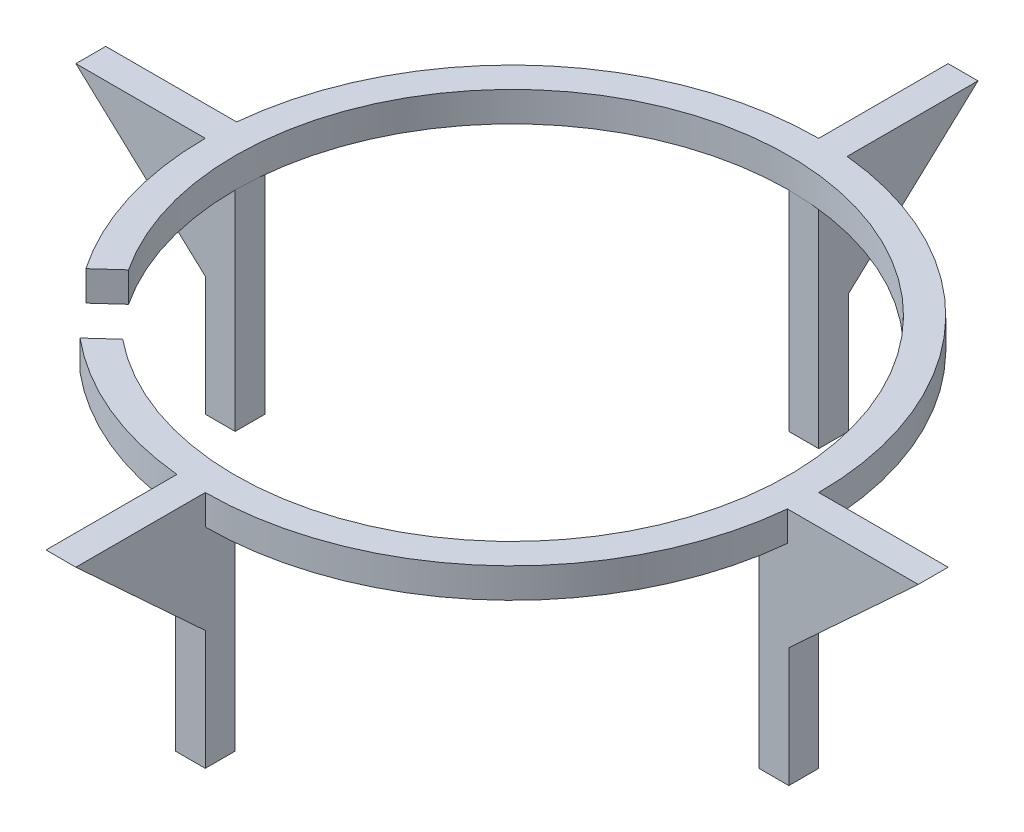
ISO-10303-21;
HEADER;
FILE_DESCRIPTION(('STEP AP214'),'2;1');
FILE_NAME('part.step','',(''),(''),'','','');
FILE_SCHEMA(('AUTOMOTIVE_DESIGN { 1 0 10303 214 1 1 1 1 }'));
ENDSEC;
DATA;
#1=APPLICATION_CONTEXT('core data for automotive mechanical design processes');
#2=APPLICATION_PROTOCOL_DEFINITION('international standard','automotive_design',2000,#1);
#3=PRODUCT_CONTEXT('',#1,'mechanical');
#4=PRODUCT('Part','Part','',(#3));
#5=PRODUCT_RELATED_PRODUCT_CATEGORY('part','',(#4));
#6=PRODUCT_DEFINITION_FORMATION('','',#4);
#7=PRODUCT_DEFINITION_CONTEXT('part definition',#1,'design');
#8=PRODUCT_DEFINITION('design','',#6,#7);
#9=PRODUCT_DEFINITION_SHAPE('','',#8);
#10=(LENGTH_UNIT() NAMED_UNIT(*) SI_UNIT(.MILLI.,.METRE.));
#11=(NAMED_UNIT(*) PLANE_ANGLE_UNIT() SI_UNIT($,.RADIAN.));
#12=(NAMED_UNIT(*) SI_UNIT($,.STERADIAN.) SOLID_ANGLE_UNIT());
#13=UNCERTAINTY_MEASURE_WITH_UNIT(LENGTH_MEASURE(1.E-05),#10,'distance_accuracy_value','');
#14=(GEOMETRIC_REPRESENTATION_CONTEXT(3) GLOBAL_UNCERTAINTY_ASSIGNED_CONTEXT((#13)) GLOBAL_UNIT_ASSIGNED_CONTEXT((#10,
#11,#12)) REPRESENTATION_CONTEXT('',''));
#15=CARTESIAN_POINT('',(0.,0.,0.));
#16=DIRECTION('',(0.,0.,1.));
#17=DIRECTION('',(1.,0.,0.));
#18=AXIS2_PLACEMENT_3D('',#15,#16,#17);
#19=CARTESIAN_POINT('',(-204.147335824536,-7.5,0.));
#20=DIRECTION('',(0.,1.,0.));
#21=DIRECTION('',(0.,0.,-1.));
#22=AXIS2_PLACEMENT_3D('',#19,#20,#21);
#23=PLANE('',#22);
#24=DIRECTION('',(-0.740730944108001,0.,0.671801807411136));
#25=VECTOR('',#24,1.);
#26=CARTESIAN_POINT('',(-163.898926075327,-7.5,44.3780326630348));
#27=LINE('',#26,#25);
#28=CARTESIAN_POINT('',(-174.583131741903,-7.5,54.0680135321355));
#29=VERTEX_POINT('',#28);
#30=CARTESIAN_POINT('',(-180.198752894633,-7.5,59.1610698843092));
#31=VERTEX_POINT('',#30);
#32=EDGE_CURVE('E38',#29,#31,#27,.T.);
#33=ORIENTED_EDGE('',*,*,#32,.F.);
#34=CARTESIAN_POINT('',(-130.867335824536,-7.5,0.));
#35=DIRECTION('',(0.,1.,0.));
#36=DIRECTION('',(0.,0.,-1.));
#37=AXIS2_PLACEMENT_3D('',#34,#35,#36);
#38=CIRCLE('',#37,69.53);
#39=CARTESIAN_POINT('',(-130.867335824536,-7.5,69.53));
#40=VERTEX_POINT('',#39);
#41=EDGE_CURVE('E250',#29,#40,#38,.T.);
#42=ORIENTED_EDGE('',*,*,#41,.T.);
#43=DIRECTION('',(1.,0.,0.));
#44=VECTOR('',#43,1.);
#45=CARTESIAN_POINT('',(-138.367335824536,-7.5,69.53));
#46=LINE('',#45,#44);
#47=CARTESIAN_POINT('',(-138.367335824536,-7.5,69.53));
#48=VERTEX_POINT('',#47);
#49=EDGE_CURVE('E259',#48,#40,#46,.T.);
#50=ORIENTED_EDGE('',*,*,#49,.F.);
#51=DIRECTION('',(0.,0.,-1.));
#52=VECTOR('',#51,1.);
#53=CARTESIAN_POINT('',(-138.367335824536,-7.5,89.53));
#54=LINE('',#53,#52);
#55=CARTESIAN_POINT('',(-138.367335824536,-7.5,76.6640130700187));
#56=VERTEX_POINT('',#55);
#57=EDGE_CURVE('E297',#56,#48,#54,.T.);
#58=ORIENTED_EDGE('',*,*,#57,.F.);
#59=CARTESIAN_POINT('',(-130.867335824536,-7.5,0.));
#60=DIRECTION('',(0.,1.,0.));
#61=DIRECTION('',(0.,0.,-1.));
#62=AXIS2_PLACEMENT_3D('',#59,#60,#61);
#63=CIRCLE('',#62,77.03);
#64=EDGE_CURVE('E252',#31,#56,#63,.T.);
#65=ORIENTED_EDGE('',*,*,#64,.F.);
#66=EDGE_LOOP('',(#33,#42,#50,#58,#65));
#67=FACE_BOUND('',#66,.T.);
#68=ADVANCED_FACE('F16',(#67),#23,.F.);
#69=CARTESIAN_POINT('',(-130.867335824536,-18.1504614045984,0.));
#70=DIRECTION('',(0.,1.,0.));
#71=DIRECTION('',(0.,0.,-1.));
#72=AXIS2_PLACEMENT_3D('',#69,#70,#71);
#73=CYLINDRICAL_SURFACE('',#72,77.03);
#74=CARTESIAN_POINT('',(-130.867335824536,0.,0.));
#75=DIRECTION('',(0.,1.,0.));
#76=DIRECTION('',(0.,0.,-1.));
#77=AXIS2_PLACEMENT_3D('',#74,#75,#76);
#78=CIRCLE('',#77,77.03);
#79=CARTESIAN_POINT('',(-180.198752894633,0.,59.1610698843092));
#80=VERTEX_POINT('',#79);
#81=CARTESIAN_POINT('',(-138.367335824536,0.,76.6640130700187));
#82=VERTEX_POINT('',#81);
#83=EDGE_CURVE('E236',#80,#82,#78,.T.);
#84=ORIENTED_EDGE('',*,*,#83,.F.);
#85=DIRECTION('',(0.,1.,0.));
#86=VECTOR('',#85,1.);
#87=CARTESIAN_POINT('',(-180.198752894633,-25.,59.1610698843092));
#88=LINE('',#87,#86);
#89=EDGE_CURVE('E221',#31,#80,#88,.T.);
#90=ORIENTED_EDGE('',*,*,#89,.F.);
#91=ORIENTED_EDGE('',*,*,#64,.T.);
#92=DIRECTION('',(0.,1.,0.));
#93=VECTOR('',#92,1.);
#94=CARTESIAN_POINT('',(-138.367335824536,-18.1504614045984,76.6640130700187));
#95=LINE('',#94,#93);
#96=EDGE_CURVE('E245',#56,#82,#95,.T.);
#97=ORIENTED_EDGE('',*,*,#96,.T.);
#98=EDGE_LOOP('',(#84,#90,#91,#97));
#99=FACE_BOUND('',#98,.T.);
#100=ADVANCED_FACE('F243',(#99),#73,.T.);
#101=CARTESIAN_POINT('',(-61.3373358245363,-30.,7.5));
#102=DIRECTION('',(-1.,0.,0.));
#103=DIRECTION('',(0.,-1.,0.));
#104=AXIS2_PLACEMENT_3D('',#101,#102,#103);
#105=PLANE('',#104);
#106=DIRECTION('',(0.,1.,0.));
#107=VECTOR('',#106,1.);
#108=CARTESIAN_POINT('',(-61.3373358245363,-30.,7.5));
#109=LINE('',#108,#107);
#110=CARTESIAN_POINT('',(-61.3373358245363,-60.,7.5));
#111=VERTEX_POINT('',#110);
#112=CARTESIAN_POINT('',(-61.3373358245363,-7.5,7.5));
#113=VERTEX_POINT('',#112);
#114=EDGE_CURVE('E317',#111,#113,#109,.T.);
#115=ORIENTED_EDGE('',*,*,#114,.T.);
#116=DIRECTION('',(0.,0.,-1.));
#117=VECTOR('',#116,1.);
#118=CARTESIAN_POINT('',(-61.3373358245363,-7.5,7.5));
#119=LINE('',#118,#117);
#120=CARTESIAN_POINT('',(-61.3373358245363,-7.5,0.));
#121=VERTEX_POINT('',#120);
#122=EDGE_CURVE('E314',#113,#121,#119,.T.);
#123=ORIENTED_EDGE('',*,*,#122,.T.);
#124=DIRECTION('',(0.,1.,0.));
#125=VECTOR('',#124,1.);
#126=CARTESIAN_POINT('',(-61.3373358245363,-30.,0.));
#127=LINE('',#126,#125);
#128=CARTESIAN_POINT('',(-61.3373358245363,-60.,0.));
#129=VERTEX_POINT('',#128);
#130=EDGE_CURVE('E316',#129,#121,#127,.T.);
#131=ORIENTED_EDGE('',*,*,#130,.F.);
#132=DIRECTION('',(0.,0.,-1.));
#133=VECTOR('',#132,1.);
#134=CARTESIAN_POINT('',(-61.3373358245363,-60.,7.5));
#135=LINE('',#134,#133);
#136=EDGE_CURVE('E348',#111,#129,#135,.T.);
#137=ORIENTED_EDGE('',*,*,#136,.F.);
#138=EDGE_LOOP('',(#115,#123,#131,#137));
#139=FACE_BOUND('',#138,.T.);
#140=ADVANCED_FACE('F18',(#139),#105,.T.);
#141=CARTESIAN_POINT('',(-41.3373358245362,-30.,7.5));
#142=DIRECTION('',(0.,0.,1.));
#143=DIRECTION('',(1.,0.,0.));
#144=AXIS2_PLACEMENT_3D('',#141,#142,#143);
#145=PLANE('',#144);
#146=DIRECTION('',(0.,1.,0.));
#147=VECTOR('',#146,1.);
#148=CARTESIAN_POINT('',(-54.2033227545176,-18.1504614045984,7.5));
#149=LINE('',#148,#147);
#150=CARTESIAN_POINT('',(-54.2033227545176,-7.5,7.5));
#151=VERTEX_POINT('',#150);
#152=CARTESIAN_POINT('',(-54.2033227545176,0.,7.5));
#153=VERTEX_POINT('',#152);
#154=EDGE_CURVE('E350',#151,#153,#149,.T.);
#155=ORIENTED_EDGE('',*,*,#154,.F.);
#156=DIRECTION('',(-1.,0.,0.));
#157=VECTOR('',#156,1.);
#158=CARTESIAN_POINT('',(-41.3373358245363,-7.5,7.5));
#159=LINE('',#158,#157);
#160=EDGE_CURVE('E24',#151,#113,#159,.T.);
#161=ORIENTED_EDGE('',*,*,#160,.T.);
#162=ORIENTED_EDGE('',*,*,#114,.F.);
#163=DIRECTION('',(1.,0.,0.));
#164=VECTOR('',#163,1.);
#165=CARTESIAN_POINT('',(-57.5873358245363,-60.,7.5));
#166=LINE('',#165,#164);
#167=CARTESIAN_POINT('',(-53.8373358245363,-60.,7.5));
#168=VERTEX_POINT('',#167);
#169=EDGE_CURVE('E320',#111,#168,#166,.T.);
#170=ORIENTED_EDGE('',*,*,#169,.T.);
#171=DIRECTION('',(0.,1.,0.));
#172=VECTOR('',#171,1.);
#173=CARTESIAN_POINT('',(-53.8373358245363,-45.,7.5));
#174=LINE('',#173,#172);
#175=CARTESIAN_POINT('',(-53.8373358245363,-30.,7.5));
#176=VERTEX_POINT('',#175);
#177=EDGE_CURVE('E323',#168,#176,#174,.T.);
#178=ORIENTED_EDGE('',*,*,#177,.T.);
#179=DIRECTION('',(0.734803444627488,0.678280102733066,0.));
#180=VECTOR('',#179,1.);
#181=CARTESIAN_POINT('',(-37.5873358245363,-15.,7.5));
#182=LINE('',#181,#180);
#183=CARTESIAN_POINT('',(-21.3373358245363,0.,7.5));
#184=VERTEX_POINT('',#183);
#185=EDGE_CURVE('E325',#176,#184,#182,.T.);
#186=ORIENTED_EDGE('',*,*,#185,.T.);
#187=DIRECTION('',(-1.,0.,0.));
#188=VECTOR('',#187,1.);
#189=CARTESIAN_POINT('',(-41.3373358245363,0.,7.5));
#190=LINE('',#189,#188);
#191=EDGE_CURVE('E327',#184,#153,#190,.T.);
#192=ORIENTED_EDGE('',*,*,#191,.T.);
#193=EDGE_LOOP('',(#155,#161,#162,#170,#178,#186,#192));
#194=FACE_BOUND('',#193,.T.);
#195=ADVANCED_FACE('F355',(#194),#145,.T.);
#196=CARTESIAN_POINT('',(-57.5873358245363,-60.,7.5));
#197=DIRECTION('',(0.,1.,0.));
#198=DIRECTION('',(0.,0.,1.));
#199=AXIS2_PLACEMENT_3D('',#196,#197,#198);
#200=PLANE('',#199);
#201=DIRECTION('',(1.,0.,0.));
#202=VECTOR('',#201,1.);
#203=CARTESIAN_POINT('',(-57.5873358245363,-60.,0.));
#204=LINE('',#203,#202);
#205=CARTESIAN_POINT('',(-53.8373358245363,-60.,0.));
#206=VERTEX_POINT('',#205);
#207=EDGE_CURVE('E332',#129,#206,#204,.T.);
#208=ORIENTED_EDGE('',*,*,#207,.T.);
#209=DIRECTION('',(0.,0.,-1.));
#210=VECTOR('',#209,1.);
#211=CARTESIAN_POINT('',(-53.8373358245363,-60.,7.5));
#212=LINE('',#211,#210);
#213=EDGE_CURVE('E345',#168,#206,#212,.T.);
#214=ORIENTED_EDGE('',*,*,#213,.F.);
#215=ORIENTED_EDGE('',*,*,#169,.F.);
#216=ORIENTED_EDGE('',*,*,#136,.T.);
#217=EDGE_LOOP('',(#208,#214,#215,#216));
#218=FACE_BOUND('',#217,.T.);
#219=ADVANCED_FACE('F652',(#218),#200,.F.);
#220=CARTESIAN_POINT('',(-53.8373358245363,-45.,7.5));
#221=DIRECTION('',(-1.,0.,0.));
#222=DIRECTION('',(0.,-1.,0.));
#223=AXIS2_PLACEMENT_3D('',#220,#221,#222);
#224=PLANE('',#223);
#225=DIRECTION('',(0.,1.,0.));
#226=VECTOR('',#225,1.);
#227=CARTESIAN_POINT('',(-53.8373358245363,-45.,0.));
#228=LINE('',#227,#226);
#229=CARTESIAN_POINT('',(-53.8373358245363,-30.,0.));
#230=VERTEX_POINT('',#229);
#231=EDGE_CURVE('E334',#206,#230,#228,.T.);
#232=ORIENTED_EDGE('',*,*,#231,.T.);
#233=DIRECTION('',(0.,0.,-1.));
#234=VECTOR('',#233,1.);
#235=CARTESIAN_POINT('',(-53.8373358245363,-30.,7.5));
#236=LINE('',#235,#234);
#237=EDGE_CURVE('E342',#176,#230,#236,.T.);
#238=ORIENTED_EDGE('',*,*,#237,.F.);
#239=ORIENTED_EDGE('',*,*,#177,.F.);
#240=ORIENTED_EDGE('',*,*,#213,.T.);
#241=EDGE_LOOP('',(#232,#238,#239,#240));
#242=FACE_BOUND('',#241,.T.);
#243=ADVANCED_FACE('F659',(#242),#224,.F.);
#244=CARTESIAN_POINT('',(-37.5873358245363,-15.,7.5));
#245=DIRECTION('',(-0.678280102733066,0.734803444627488,0.));
#246=DIRECTION('',(-0.734803444627488,-0.678280102733066,0.));
#247=AXIS2_PLACEMENT_3D('',#244,#245,#246);
#248=PLANE('',#247);
#249=DIRECTION('',(0.734803444627488,0.678280102733066,0.));
#250=VECTOR('',#249,1.);
#251=CARTESIAN_POINT('',(-37.5873358245363,-15.,0.));
#252=LINE('',#251,#250);
#253=CARTESIAN_POINT('',(-21.3373358245363,0.,0.));
#254=VERTEX_POINT('',#253);
#255=EDGE_CURVE('E336',#230,#254,#252,.T.);
#256=ORIENTED_EDGE('',*,*,#255,.T.);
#257=DIRECTION('',(0.,0.,-1.));
#258=VECTOR('',#257,1.);
#259=CARTESIAN_POINT('',(-21.3373358245363,0.,7.5));
#260=LINE('',#259,#258);
#261=EDGE_CURVE('E329',#184,#254,#260,.T.);
#262=ORIENTED_EDGE('',*,*,#261,.F.);
#263=ORIENTED_EDGE('',*,*,#185,.F.);
#264=ORIENTED_EDGE('',*,*,#237,.T.);
#265=EDGE_LOOP('',(#256,#262,#263,#264));
#266=FACE_BOUND('',#265,.T.);
#267=ADVANCED_FACE('F534',(#266),#248,.F.);
#268=CARTESIAN_POINT('',(-41.3373358245363,0.,7.5));
#269=DIRECTION('',(0.,-1.,0.));
#270=DIRECTION('',(0.,0.,-1.));
#271=AXIS2_PLACEMENT_3D('',#268,#269,#270);
#272=PLANE('',#271);
#273=CARTESIAN_POINT('',(-130.867335824536,0.,0.));
#274=DIRECTION('',(0.,1.,0.));
#275=DIRECTION('',(-1.,0.,0.));
#276=AXIS2_PLACEMENT_3D('',#273,#274,#275);
#277=CIRCLE('',#276,69.53);
#278=CARTESIAN_POINT('',(-174.583131741903,0.,54.0680135321355));
#279=VERTEX_POINT('',#278);
#280=CARTESIAN_POINT('',(-188.934833753626,0.,38.2437783731562));
#281=VERTEX_POINT('',#280);
#282=EDGE_CURVE('E239',#279,#281,#277,.T.);
#283=ORIENTED_EDGE('',*,*,#282,.F.);
#284=DIRECTION('',(-0.740730944108001,0.,0.671801807411136));
#285=VECTOR('',#284,1.);
#286=CARTESIAN_POINT('',(-177.390942318268,0.,56.6145417082223));
#287=LINE('',#286,#285);
#288=EDGE_CURVE('E224',#279,#80,#287,.T.);
#289=ORIENTED_EDGE('',*,*,#288,.T.);
#290=ORIENTED_EDGE('',*,*,#83,.T.);
#291=DIRECTION('',(0.,0.,-1.));
#292=VECTOR('',#291,1.);
#293=CARTESIAN_POINT('',(-138.367335824536,0.,89.53));
#294=LINE('',#293,#292);
#295=CARTESIAN_POINT('',(-138.367335824536,0.,109.53));
#296=VERTEX_POINT('',#295);
#297=EDGE_CURVE('E273',#296,#82,#294,.T.);
#298=ORIENTED_EDGE('',*,*,#297,.F.);
#299=DIRECTION('',(1.,0.,0.));
#300=VECTOR('',#299,1.);
#301=CARTESIAN_POINT('',(-138.367335824536,0.,109.53));
#302=LINE('',#301,#300);
#303=CARTESIAN_POINT('',(-130.867335824536,0.,109.53));
#304=VERTEX_POINT('',#303);
#305=EDGE_CURVE('E275',#296,#304,#302,.T.);
#306=ORIENTED_EDGE('',*,*,#305,.T.);
#307=DIRECTION('',(0.,0.,-1.));
#308=VECTOR('',#307,1.);
#309=CARTESIAN_POINT('',(-130.867335824536,0.,89.53));
#310=LINE('',#309,#308);
#311=CARTESIAN_POINT('',(-130.867335824536,0.,77.03));
#312=VERTEX_POINT('',#311);
#313=EDGE_CURVE('E267',#304,#312,#310,.T.);
#314=ORIENTED_EDGE('',*,*,#313,.T.);
#315=CARTESIAN_POINT('',(-130.867335824536,0.,0.));
#316=DIRECTION('',(0.,1.,0.));
#317=DIRECTION('',(-1.,0.,0.));
#318=AXIS2_PLACEMENT_3D('',#315,#316,#317);
#319=CIRCLE('',#318,77.03);
#320=EDGE_CURVE('E307',#312,#153,#319,.T.);
#321=ORIENTED_EDGE('',*,*,#320,.T.);
#322=ORIENTED_EDGE('',*,*,#191,.F.);
#323=ORIENTED_EDGE('',*,*,#261,.T.);
#324=DIRECTION('',(-1.,0.,0.));
#325=VECTOR('',#324,1.);
#326=CARTESIAN_POINT('',(-41.3373358245363,0.,0.));
#327=LINE('',#326,#325);
#328=CARTESIAN_POINT('',(-53.8373358245363,0.,0.));
#329=VERTEX_POINT('',#328);
#330=EDGE_CURVE('E321',#254,#329,#327,.T.);
#331=ORIENTED_EDGE('',*,*,#330,.T.);
#332=CARTESIAN_POINT('',(-130.867335824536,0.,0.));
#333=DIRECTION('',(0.,1.,0.));
#334=DIRECTION('',(0.,0.,1.));
#335=AXIS2_PLACEMENT_3D('',#332,#333,#334);
#336=CIRCLE('',#335,77.03);
#337=CARTESIAN_POINT('',(-123.367335824536,0.,-76.6640130700187));
#338=VERTEX_POINT('',#337);
#339=EDGE_CURVE('E380',#329,#338,#336,.T.);
#340=ORIENTED_EDGE('',*,*,#339,.T.);
#341=DIRECTION('',(0.,0.,1.));
#342=VECTOR('',#341,1.);
#343=CARTESIAN_POINT('',(-123.367335824536,0.,-89.53));
#344=LINE('',#343,#342);
#345=CARTESIAN_POINT('',(-123.367335824536,0.,-109.53));
#346=VERTEX_POINT('',#345);
#347=EDGE_CURVE('E411',#346,#338,#344,.T.);
#348=ORIENTED_EDGE('',*,*,#347,.F.);
#349=DIRECTION('',(-1.,0.,0.));
#350=VECTOR('',#349,1.);
#351=CARTESIAN_POINT('',(-123.367335824536,0.,-109.53));
#352=LINE('',#351,#350);
#353=CARTESIAN_POINT('',(-130.867335824536,0.,-109.53));
#354=VERTEX_POINT('',#353);
#355=EDGE_CURVE('E413',#346,#354,#352,.T.);
#356=ORIENTED_EDGE('',*,*,#355,.T.);
#357=DIRECTION('',(0.,0.,1.));
#358=VECTOR('',#357,1.);
#359=CARTESIAN_POINT('',(-130.867335824536,0.,-89.53));
#360=LINE('',#359,#358);
#361=CARTESIAN_POINT('',(-130.867335824536,0.,-77.03));
#362=VERTEX_POINT('',#361);
#363=EDGE_CURVE('E405',#354,#362,#360,.T.);
#364=ORIENTED_EDGE('',*,*,#363,.T.);
#365=CARTESIAN_POINT('',(-130.867335824536,0.,0.));
#366=DIRECTION('',(0.,1.,0.));
#367=DIRECTION('',(1.,0.,0.));
#368=AXIS2_PLACEMENT_3D('',#365,#366,#367);
#369=CIRCLE('',#368,77.03);
#370=CARTESIAN_POINT('',(-207.531348894555,0.,-7.5));
#371=VERTEX_POINT('',#370);
#372=EDGE_CURVE('E447',#362,#371,#369,.T.);
#373=ORIENTED_EDGE('',*,*,#372,.T.);
#374=DIRECTION('',(1.,0.,0.));
#375=VECTOR('',#374,1.);
#376=CARTESIAN_POINT('',(-220.397335824536,0.,-7.5));
#377=LINE('',#376,#375);
#378=CARTESIAN_POINT('',(-240.397335824536,0.,-7.5));
#379=VERTEX_POINT('',#378);
#380=EDGE_CURVE('E464',#379,#371,#377,.T.);
#381=ORIENTED_EDGE('',*,*,#380,.F.);
#382=DIRECTION('',(0.,0.,1.));
#383=VECTOR('',#382,1.);
#384=CARTESIAN_POINT('',(-240.397335824536,0.,-7.5));
#385=LINE('',#384,#383);
#386=CARTESIAN_POINT('',(-240.397335824536,0.,0.));
#387=VERTEX_POINT('',#386);
#388=EDGE_CURVE('E466',#379,#387,#385,.T.);
#389=ORIENTED_EDGE('',*,*,#388,.T.);
#390=DIRECTION('',(1.,0.,0.));
#391=VECTOR('',#390,1.);
#392=CARTESIAN_POINT('',(-220.397335824536,0.,0.));
#393=LINE('',#392,#391);
#394=CARTESIAN_POINT('',(-207.897335824536,0.,0.));
#395=VERTEX_POINT('',#394);
#396=EDGE_CURVE('E458',#387,#395,#393,.T.);
#397=ORIENTED_EDGE('',*,*,#396,.T.);
#398=CARTESIAN_POINT('',(-194.550454906357,0.,43.3368347253299));
#399=VERTEX_POINT('',#398);
#400=EDGE_CURVE('E246',#395,#399,#78,.T.);
#401=ORIENTED_EDGE('',*,*,#400,.T.);
#402=DIRECTION('',(-0.740730944108003,0.,0.671801807411134));
#403=VECTOR('',#402,1.);
#404=CARTESIAN_POINT('',(-192.59506106161,0.,41.5634011600781));
#405=LINE('',#404,#403);
#406=EDGE_CURVE('E30',#281,#399,#405,.T.);
#407=ORIENTED_EDGE('',*,*,#406,.F.);
#408=EDGE_LOOP('',(#283,#289,#290,#298,#306,#314,#321,#322,#323,#331,#340,#348,#356,#364,#373,
#381,#389,#397,#401,#407));
#409=FACE_BOUND('',#408,.T.);
#410=ADVANCED_FACE('F234',(#409),#272,.F.);
#411=CARTESIAN_POINT('',(-41.3373358245362,-30.,0.));
#412=DIRECTION('',(0.,0.,1.));
#413=DIRECTION('',(1.,0.,0.));
#414=AXIS2_PLACEMENT_3D('',#411,#412,#413);
#415=PLANE('',#414);
#416=ORIENTED_EDGE('',*,*,#130,.T.);
#417=DIRECTION('',(1.,0.,0.));
#418=VECTOR('',#417,1.);
#419=CARTESIAN_POINT('',(-57.5873358245363,-7.5,0.));
#420=LINE('',#419,#418);
#421=CARTESIAN_POINT('',(-53.8373358245363,-7.5,0.));
#422=VERTEX_POINT('',#421);
#423=EDGE_CURVE('E383',#121,#422,#420,.T.);
#424=ORIENTED_EDGE('',*,*,#423,.T.);
#425=DIRECTION('',(0.,-1.,0.));
#426=VECTOR('',#425,1.);
#427=CARTESIAN_POINT('',(-53.8373358245363,-3.75,0.));
#428=LINE('',#427,#426);
#429=EDGE_CURVE('E390',#329,#422,#428,.T.);
#430=ORIENTED_EDGE('',*,*,#429,.F.);
#431=ORIENTED_EDGE('',*,*,#330,.F.);
#432=ORIENTED_EDGE('',*,*,#255,.F.);
#433=ORIENTED_EDGE('',*,*,#231,.F.);
#434=ORIENTED_EDGE('',*,*,#207,.F.);
#435=EDGE_LOOP('',(#416,#424,#430,#431,#432,#433,#434));
#436=FACE_BOUND('',#435,.T.);
#437=ADVANCED_FACE('F537',(#436),#415,.F.);
#438=CARTESIAN_POINT('',(-130.867335824536,-7.5,73.28));
#439=DIRECTION('',(0.,1.,0.));
#440=DIRECTION('',(-1.,0.,0.));
#441=AXIS2_PLACEMENT_3D('',#438,#439,#440);
#442=PLANE('',#441);
#443=ORIENTED_EDGE('',*,*,#122,.F.);
#444=ORIENTED_EDGE('',*,*,#160,.F.);
#445=CARTESIAN_POINT('',(-130.867335824536,-7.5,0.));
#446=DIRECTION('',(0.,1.,0.));
#447=DIRECTION('',(-1.,0.,0.));
#448=AXIS2_PLACEMENT_3D('',#445,#446,#447);
#449=CIRCLE('',#448,77.03);
#450=CARTESIAN_POINT('',(-130.867335824536,-7.5,77.03));
#451=VERTEX_POINT('',#450);
#452=EDGE_CURVE('E304',#451,#151,#449,.T.);
#453=ORIENTED_EDGE('',*,*,#452,.F.);
#454=DIRECTION('',(0.,0.,1.));
#455=VECTOR('',#454,1.);
#456=CARTESIAN_POINT('',(-130.867335824536,-7.5,73.28));
#457=LINE('',#456,#455);
#458=EDGE_CURVE('E299',#40,#451,#457,.T.);
#459=ORIENTED_EDGE('',*,*,#458,.F.);
#460=CARTESIAN_POINT('',(-130.867335824536,-7.5,0.));
#461=DIRECTION('',(0.,1.,0.));
#462=DIRECTION('',(-1.,0.,0.));
#463=AXIS2_PLACEMENT_3D('',#460,#461,#462);
#464=CIRCLE('',#463,69.53);
#465=EDGE_CURVE('E311',#40,#121,#464,.T.);
#466=ORIENTED_EDGE('',*,*,#465,.T.);
#467=EDGE_LOOP('',(#443,#444,#453,#459,#466));
#468=FACE_BOUND('',#467,.T.);
#469=ADVANCED_FACE('F362',(#468),#442,.F.);
#470=CARTESIAN_POINT('',(-130.867335824536,-18.1504614045984,0.));
#471=DIRECTION('',(0.,1.,0.));
#472=DIRECTION('',(-1.,0.,0.));
#473=AXIS2_PLACEMENT_3D('',#470,#471,#472);
#474=CYLINDRICAL_SURFACE('',#473,69.53);
#475=DIRECTION('',(0.,1.,0.));
#476=VECTOR('',#475,1.);
#477=CARTESIAN_POINT('',(-174.583131741903,-25.,54.0680135321355));
#478=LINE('',#477,#476);
#479=EDGE_CURVE('E230',#29,#279,#478,.T.);
#480=ORIENTED_EDGE('',*,*,#479,.T.);
#481=ORIENTED_EDGE('',*,*,#282,.T.);
#482=DIRECTION('',(0.,1.,0.));
#483=VECTOR('',#482,1.);
#484=CARTESIAN_POINT('',(-188.934833753626,-25.,38.2437783731562));
#485=LINE('',#484,#483);
#486=CARTESIAN_POINT('',(-188.934833753626,-7.5,38.2437783731562));
#487=VERTEX_POINT('',#486);
#488=EDGE_CURVE('E240',#487,#281,#485,.T.);
#489=ORIENTED_EDGE('',*,*,#488,.F.);
#490=CARTESIAN_POINT('',(-200.397335824536,-7.5,0.));
#491=VERTEX_POINT('',#490);
#492=EDGE_CURVE('E256',#491,#487,#38,.T.);
#493=ORIENTED_EDGE('',*,*,#492,.F.);
#494=CARTESIAN_POINT('',(-130.867335824536,-7.5,0.));
#495=DIRECTION('',(0.,1.,0.));
#496=DIRECTION('',(1.,0.,0.));
#497=AXIS2_PLACEMENT_3D('',#494,#495,#496);
#498=CIRCLE('',#497,69.53);
#499=CARTESIAN_POINT('',(-130.867335824536,-7.5,-69.53));
#500=VERTEX_POINT('',#499);
#501=EDGE_CURVE('E375',#500,#491,#498,.T.);
#502=ORIENTED_EDGE('',*,*,#501,.F.);
#503=CARTESIAN_POINT('',(-130.867335824536,-7.5,0.));
#504=DIRECTION('',(0.,1.,0.));
#505=DIRECTION('',(0.,0.,1.));
#506=AXIS2_PLACEMENT_3D('',#503,#504,#505);
#507=CIRCLE('',#506,69.53);
#508=EDGE_CURVE('E370',#121,#500,#507,.T.);
#509=ORIENTED_EDGE('',*,*,#508,.F.);
#510=ORIENTED_EDGE('',*,*,#465,.F.);
#511=ORIENTED_EDGE('',*,*,#41,.F.);
#512=EDGE_LOOP('',(#480,#481,#489,#493,#502,#509,#510,#511));
#513=FACE_BOUND('',#512,.T.);
#514=ADVANCED_FACE('F372',(#513),#474,.F.);
#515=CARTESIAN_POINT('',(-130.867335824536,-18.1504614045984,0.));
#516=DIRECTION('',(0.,1.,0.));
#517=DIRECTION('',(-1.,0.,0.));
#518=AXIS2_PLACEMENT_3D('',#515,#516,#517);
#519=CYLINDRICAL_SURFACE('',#518,77.03);
#520=ORIENTED_EDGE('',*,*,#452,.T.);
#521=ORIENTED_EDGE('',*,*,#154,.T.);
#522=ORIENTED_EDGE('',*,*,#320,.F.);
#523=DIRECTION('',(0.,-1.,0.));
#524=VECTOR('',#523,1.);
#525=CARTESIAN_POINT('',(-130.867335824536,-3.75,77.03));
#526=LINE('',#525,#524);
#527=EDGE_CURVE('E301',#312,#451,#526,.T.);
#528=ORIENTED_EDGE('',*,*,#527,.T.);
#529=EDGE_LOOP('',(#520,#521,#522,#528));
#530=FACE_BOUND('',#529,.T.);
#531=ADVANCED_FACE('F526',(#530),#519,.T.);
#532=CARTESIAN_POINT('',(-130.867335824536,-30.,89.53));
#533=DIRECTION('',(-1.,0.,0.));
#534=DIRECTION('',(0.,0.,1.));
#535=AXIS2_PLACEMENT_3D('',#532,#533,#534);
#536=PLANE('',#535);
#537=DIRECTION('',(0.,1.,0.));
#538=VECTOR('',#537,1.);
#539=CARTESIAN_POINT('',(-130.867335824536,-30.,69.53));
#540=LINE('',#539,#538);
#541=CARTESIAN_POINT('',(-130.867335824536,-60.,69.53));
#542=VERTEX_POINT('',#541);
#543=EDGE_CURVE('E262',#542,#40,#540,.T.);
#544=ORIENTED_EDGE('',*,*,#543,.T.);
#545=ORIENTED_EDGE('',*,*,#458,.T.);
#546=ORIENTED_EDGE('',*,*,#527,.F.);
#547=ORIENTED_EDGE('',*,*,#313,.F.);
#548=DIRECTION('',(0.,0.678280102733066,0.734803444627488));
#549=VECTOR('',#548,1.);
#550=CARTESIAN_POINT('',(-130.867335824536,-15.,93.28));
#551=LINE('',#550,#549);
#552=CARTESIAN_POINT('',(-130.867335824536,-30.,77.03));
#553=VERTEX_POINT('',#552);
#554=EDGE_CURVE('E282',#553,#304,#551,.T.);
#555=ORIENTED_EDGE('',*,*,#554,.F.);
#556=DIRECTION('',(0.,1.,0.));
#557=VECTOR('',#556,1.);
#558=CARTESIAN_POINT('',(-130.867335824536,-45.,77.03));
#559=LINE('',#558,#557);
#560=CARTESIAN_POINT('',(-130.867335824536,-60.,77.03));
#561=VERTEX_POINT('',#560);
#562=EDGE_CURVE('E280',#561,#553,#559,.T.);
#563=ORIENTED_EDGE('',*,*,#562,.F.);
#564=DIRECTION('',(0.,0.,1.));
#565=VECTOR('',#564,1.);
#566=CARTESIAN_POINT('',(-130.867335824536,-60.,73.28));
#567=LINE('',#566,#565);
#568=EDGE_CURVE('E278',#542,#561,#567,.T.);
#569=ORIENTED_EDGE('',*,*,#568,.F.);
#570=EDGE_LOOP('',(#544,#545,#546,#547,#555,#563,#569));
#571=FACE_BOUND('',#570,.T.);
#572=ADVANCED_FACE('F508',(#571),#536,.F.);
#573=CARTESIAN_POINT('',(-138.367335824536,-30.,69.53));
#574=DIRECTION('',(0.,0.,-1.));
#575=DIRECTION('',(0.,-1.,0.));
#576=AXIS2_PLACEMENT_3D('',#573,#574,#575);
#577=PLANE('',#576);
#578=DIRECTION('',(0.,1.,0.));
#579=VECTOR('',#578,1.);
#580=CARTESIAN_POINT('',(-138.367335824536,-30.,69.53));
#581=LINE('',#580,#579);
#582=CARTESIAN_POINT('',(-138.367335824536,-60.,69.53));
#583=VERTEX_POINT('',#582);
#584=EDGE_CURVE('E263',#583,#48,#581,.T.);
#585=ORIENTED_EDGE('',*,*,#584,.T.);
#586=ORIENTED_EDGE('',*,*,#49,.T.);
#587=ORIENTED_EDGE('',*,*,#543,.F.);
#588=DIRECTION('',(1.,0.,0.));
#589=VECTOR('',#588,1.);
#590=CARTESIAN_POINT('',(-138.367335824536,-60.,69.53));
#591=LINE('',#590,#589);
#592=EDGE_CURVE('E294',#583,#542,#591,.T.);
#593=ORIENTED_EDGE('',*,*,#592,.F.);
#594=EDGE_LOOP('',(#585,#586,#587,#593));
#595=FACE_BOUND('',#594,.T.);
#596=ADVANCED_FACE('F505',(#595),#577,.T.);
#597=CARTESIAN_POINT('',(-138.367335824536,-30.,89.53));
#598=DIRECTION('',(-1.,0.,0.));
#599=DIRECTION('',(0.,0.,1.));
#600=AXIS2_PLACEMENT_3D('',#597,#598,#599);
#601=PLANE('',#600);
#602=ORIENTED_EDGE('',*,*,#96,.F.);
#603=ORIENTED_EDGE('',*,*,#57,.T.);
#604=ORIENTED_EDGE('',*,*,#584,.F.);
#605=DIRECTION('',(0.,0.,1.));
#606=VECTOR('',#605,1.);
#607=CARTESIAN_POINT('',(-138.367335824536,-60.,73.28));
#608=LINE('',#607,#606);
#609=CARTESIAN_POINT('',(-138.367335824536,-60.,77.03));
#610=VERTEX_POINT('',#609);
#611=EDGE_CURVE('E266',#583,#610,#608,.T.);
#612=ORIENTED_EDGE('',*,*,#611,.T.);
#613=DIRECTION('',(0.,1.,0.));
#614=VECTOR('',#613,1.);
#615=CARTESIAN_POINT('',(-138.367335824536,-45.,77.03));
#616=LINE('',#615,#614);
#617=CARTESIAN_POINT('',(-138.367335824536,-30.,77.03));
#618=VERTEX_POINT('',#617);
#619=EDGE_CURVE('E269',#610,#618,#616,.T.);
#620=ORIENTED_EDGE('',*,*,#619,.T.);
#621=DIRECTION('',(0.,0.678280102733066,0.734803444627488));
#622=VECTOR('',#621,1.);
#623=CARTESIAN_POINT('',(-138.367335824536,-15.,93.28));
#624=LINE('',#623,#622);
#625=EDGE_CURVE('E271',#618,#296,#624,.T.);
#626=ORIENTED_EDGE('',*,*,#625,.T.);
#627=ORIENTED_EDGE('',*,*,#297,.T.);
#628=EDGE_LOOP('',(#602,#603,#604,#612,#620,#626,#627));
#629=FACE_BOUND('',#628,.T.);
#630=ADVANCED_FACE('F500',(#629),#601,.T.);
#631=CARTESIAN_POINT('',(-138.367335824536,-60.,73.28));
#632=DIRECTION('',(0.,1.,0.));
#633=DIRECTION('',(-1.,0.,0.));
#634=AXIS2_PLACEMENT_3D('',#631,#632,#633);
#635=PLANE('',#634);
#636=ORIENTED_EDGE('',*,*,#568,.T.);
#637=DIRECTION('',(1.,0.,0.));
#638=VECTOR('',#637,1.);
#639=CARTESIAN_POINT('',(-138.367335824536,-60.,77.03));
#640=LINE('',#639,#638);
#641=EDGE_CURVE('E291',#610,#561,#640,.T.);
#642=ORIENTED_EDGE('',*,*,#641,.F.);
#643=ORIENTED_EDGE('',*,*,#611,.F.);
#644=ORIENTED_EDGE('',*,*,#592,.T.);
#645=EDGE_LOOP('',(#636,#642,#643,#644));
#646=FACE_BOUND('',#645,.T.);
#647=ADVANCED_FACE('F513',(#646),#635,.F.);
#648=CARTESIAN_POINT('',(-138.367335824536,-45.,77.03));
#649=DIRECTION('',(0.,0.,-1.));
#650=DIRECTION('',(0.,-1.,0.));
#651=AXIS2_PLACEMENT_3D('',#648,#649,#650);
#652=PLANE('',#651);
#653=ORIENTED_EDGE('',*,*,#562,.T.);
#654=DIRECTION('',(1.,0.,0.));
#655=VECTOR('',#654,1.);
#656=CARTESIAN_POINT('',(-138.367335824536,-30.,77.03));
#657=LINE('',#656,#655);
#658=EDGE_CURVE('E288',#618,#553,#657,.T.);
#659=ORIENTED_EDGE('',*,*,#658,.F.);
#660=ORIENTED_EDGE('',*,*,#619,.F.);
#661=ORIENTED_EDGE('',*,*,#641,.T.);
#662=EDGE_LOOP('',(#653,#659,#660,#661));
#663=FACE_BOUND('',#662,.T.);
#664=ADVANCED_FACE('F517',(#663),#652,.F.);
#665=CARTESIAN_POINT('',(-138.367335824536,-15.,93.28));
#666=DIRECTION('',(0.,0.734803444627488,-0.678280102733066));
#667=DIRECTION('',(0.,-0.678280102733066,-0.734803444627488));
#668=AXIS2_PLACEMENT_3D('',#665,#666,#667);
#669=PLANE('',#668);
#670=ORIENTED_EDGE('',*,*,#554,.T.);
#671=ORIENTED_EDGE('',*,*,#305,.F.);
#672=ORIENTED_EDGE('',*,*,#625,.F.);
#673=ORIENTED_EDGE('',*,*,#658,.T.);
#674=EDGE_LOOP('',(#670,#671,#672,#673));
#675=FACE_BOUND('',#674,.T.);
#676=ADVANCED_FACE('F522',(#675),#669,.F.);
#677=ORIENTED_EDGE('',*,*,#492,.T.);
#678=DIRECTION('',(-0.740730944108003,0.,0.671801807411134));
#679=VECTOR('',#678,1.);
#680=CARTESIAN_POINT('',(-178.250628087051,-7.5,28.5537975040555));
#681=LINE('',#680,#679);
#682=CARTESIAN_POINT('',(-194.550454906357,-7.5,43.3368347253299));
#683=VERTEX_POINT('',#682);
#684=EDGE_CURVE('E229',#487,#683,#681,.T.);
#685=ORIENTED_EDGE('',*,*,#684,.T.);
#686=CARTESIAN_POINT('',(-207.897335824536,-7.5,0.));
#687=VERTEX_POINT('',#686);
#688=EDGE_CURVE('E247',#687,#683,#63,.T.);
#689=ORIENTED_EDGE('',*,*,#688,.F.);
#690=DIRECTION('',(-1.,0.,0.));
#691=VECTOR('',#690,1.);
#692=CARTESIAN_POINT('',(-204.147335824536,-7.5,0.));
#693=LINE('',#692,#691);
#694=EDGE_CURVE('E492',#491,#687,#693,.T.);
#695=ORIENTED_EDGE('',*,*,#694,.F.);
#696=EDGE_LOOP('',(#677,#685,#689,#695));
#697=FACE_BOUND('',#696,.T.);
#698=ADVANCED_FACE('F593',(#697),#23,.F.);
#699=DIRECTION('',(0.,1.,0.));
#700=VECTOR('',#699,1.);
#701=CARTESIAN_POINT('',(-194.550454906357,-18.1504614045985,43.3368347253299));
#702=LINE('',#701,#700);
#703=EDGE_CURVE('E11',#399,#683,#702,.F.);
#704=ORIENTED_EDGE('',*,*,#703,.F.);
#705=ORIENTED_EDGE('',*,*,#400,.F.);
#706=DIRECTION('',(0.,-1.,0.));
#707=VECTOR('',#706,1.);
#708=CARTESIAN_POINT('',(-207.897335824536,-3.75000000000006,0.));
#709=LINE('',#708,#707);
#710=EDGE_CURVE('E493',#395,#687,#709,.T.);
#711=ORIENTED_EDGE('',*,*,#710,.T.);
#712=ORIENTED_EDGE('',*,*,#688,.T.);
#713=EDGE_LOOP('',(#704,#705,#711,#712));
#714=FACE_BOUND('',#713,.T.);
#715=ADVANCED_FACE('F587',(#714),#73,.T.);
#716=CARTESIAN_POINT('',(-220.397335824536,-30.,0.));
#717=DIRECTION('',(0.,0.,-1.));
#718=DIRECTION('',(-1.,0.,0.));
#719=AXIS2_PLACEMENT_3D('',#716,#717,#718);
#720=PLANE('',#719);
#721=DIRECTION('',(0.,1.,0.));
#722=VECTOR('',#721,1.);
#723=CARTESIAN_POINT('',(-200.397335824536,-30.,0.));
#724=LINE('',#723,#722);
#725=CARTESIAN_POINT('',(-200.397335824536,-60.,0.));
#726=VERTEX_POINT('',#725);
#727=EDGE_CURVE('E453',#726,#491,#724,.T.);
#728=ORIENTED_EDGE('',*,*,#727,.T.);
#729=ORIENTED_EDGE('',*,*,#694,.T.);
#730=ORIENTED_EDGE('',*,*,#710,.F.);
#731=ORIENTED_EDGE('',*,*,#396,.F.);
#732=DIRECTION('',(-0.734803444627489,0.678280102733065,0.));
#733=VECTOR('',#732,1.);
#734=CARTESIAN_POINT('',(-224.147335824536,-15.,0.));
#735=LINE('',#734,#733);
#736=CARTESIAN_POINT('',(-207.897335824536,-30.,0.));
#737=VERTEX_POINT('',#736);
#738=EDGE_CURVE('E473',#737,#387,#735,.T.);
#739=ORIENTED_EDGE('',*,*,#738,.F.);
#740=DIRECTION('',(0.,1.,0.));
#741=VECTOR('',#740,1.);
#742=CARTESIAN_POINT('',(-207.897335824536,-45.,0.));
#743=LINE('',#742,#741);
#744=CARTESIAN_POINT('',(-207.897335824536,-60.,0.));
#745=VERTEX_POINT('',#744);
#746=EDGE_CURVE('E471',#745,#737,#743,.T.);
#747=ORIENTED_EDGE('',*,*,#746,.F.);
#748=DIRECTION('',(-1.,0.,0.));
#749=VECTOR('',#748,1.);
#750=CARTESIAN_POINT('',(-204.147335824536,-60.,0.));
#751=LINE('',#750,#749);
#752=EDGE_CURVE('E469',#726,#745,#751,.T.);
#753=ORIENTED_EDGE('',*,*,#752,.F.);
#754=EDGE_LOOP('',(#728,#729,#730,#731,#739,#747,#753));
#755=FACE_BOUND('',#754,.T.);
#756=ADVANCED_FACE('F585',(#755),#720,.F.);
#757=CARTESIAN_POINT('',(-200.397335824536,-30.,-7.5));
#758=DIRECTION('',(1.,0.,0.));
#759=DIRECTION('',(0.,-1.,0.));
#760=AXIS2_PLACEMENT_3D('',#757,#758,#759);
#761=PLANE('',#760);
#762=DIRECTION('',(0.,1.,0.));
#763=VECTOR('',#762,1.);
#764=CARTESIAN_POINT('',(-200.397335824536,-30.,-7.5));
#765=LINE('',#764,#763);
#766=CARTESIAN_POINT('',(-200.397335824536,-60.,-7.5));
#767=VERTEX_POINT('',#766);
#768=CARTESIAN_POINT('',(-200.397335824536,-7.5,-7.5));
#769=VERTEX_POINT('',#768);
#770=EDGE_CURVE('E454',#767,#769,#765,.T.);
#771=ORIENTED_EDGE('',*,*,#770,.T.);
#772=DIRECTION('',(0.,0.,1.));
#773=VECTOR('',#772,1.);
#774=CARTESIAN_POINT('',(-200.397335824536,-7.5,-7.5));
#775=LINE('',#774,#773);
#776=EDGE_CURVE('E451',#769,#491,#775,.T.);
#777=ORIENTED_EDGE('',*,*,#776,.T.);
#778=ORIENTED_EDGE('',*,*,#727,.F.);
#779=DIRECTION('',(0.,0.,1.));
#780=VECTOR('',#779,1.);
#781=CARTESIAN_POINT('',(-200.397335824536,-60.,-7.5));
#782=LINE('',#781,#780);
#783=EDGE_CURVE('E485',#767,#726,#782,.T.);
#784=ORIENTED_EDGE('',*,*,#783,.F.);
#785=EDGE_LOOP('',(#771,#777,#778,#784));
#786=FACE_BOUND('',#785,.T.);
#787=ADVANCED_FACE('F604',(#786),#761,.T.);
#788=CARTESIAN_POINT('',(-220.397335824536,-30.,-7.5));
#789=DIRECTION('',(0.,0.,-1.));
#790=DIRECTION('',(-1.,0.,0.));
#791=AXIS2_PLACEMENT_3D('',#788,#789,#790);
#792=PLANE('',#791);
#793=DIRECTION('',(0.,1.,0.));
#794=VECTOR('',#793,1.);
#795=CARTESIAN_POINT('',(-207.531348894555,-18.1504614045985,-7.5));
#796=LINE('',#795,#794);
#797=CARTESIAN_POINT('',(-207.531348894555,-7.5,-7.5));
#798=VERTEX_POINT('',#797);
#799=EDGE_CURVE('E487',#798,#371,#796,.T.);
#800=ORIENTED_EDGE('',*,*,#799,.F.);
#801=DIRECTION('',(1.,0.,0.));
#802=VECTOR('',#801,1.);
#803=CARTESIAN_POINT('',(-220.397335824536,-7.5,-7.5));
#804=LINE('',#803,#802);
#805=EDGE_CURVE('E490',#798,#769,#804,.T.);
#806=ORIENTED_EDGE('',*,*,#805,.T.);
#807=ORIENTED_EDGE('',*,*,#770,.F.);
#808=DIRECTION('',(-1.,0.,0.));
#809=VECTOR('',#808,1.);
#810=CARTESIAN_POINT('',(-204.147335824536,-60.,-7.5));
#811=LINE('',#810,#809);
#812=CARTESIAN_POINT('',(-207.897335824536,-60.,-7.5));
#813=VERTEX_POINT('',#812);
#814=EDGE_CURVE('E457',#767,#813,#811,.T.);
#815=ORIENTED_EDGE('',*,*,#814,.T.);
#816=DIRECTION('',(0.,1.,0.));
#817=VECTOR('',#816,1.);
#818=CARTESIAN_POINT('',(-207.897335824536,-45.,-7.5));
#819=LINE('',#818,#817);
#820=CARTESIAN_POINT('',(-207.897335824536,-30.,-7.5));
#821=VERTEX_POINT('',#820);
#822=EDGE_CURVE('E460',#813,#821,#819,.T.);
#823=ORIENTED_EDGE('',*,*,#822,.T.);
#824=DIRECTION('',(-0.734803444627489,0.678280102733065,0.));
#825=VECTOR('',#824,1.);
#826=CARTESIAN_POINT('',(-224.147335824536,-15.,-7.5));
#827=LINE('',#826,#825);
#828=EDGE_CURVE('E462',#821,#379,#827,.T.);
#829=ORIENTED_EDGE('',*,*,#828,.T.);
#830=ORIENTED_EDGE('',*,*,#380,.T.);
#831=EDGE_LOOP('',(#800,#806,#807,#815,#823,#829,#830));
#832=FACE_BOUND('',#831,.T.);
#833=ADVANCED_FACE('F575',(#832),#792,.T.);
#834=CARTESIAN_POINT('',(-204.147335824536,-60.,-7.5));
#835=DIRECTION('',(0.,1.,0.));
#836=DIRECTION('',(0.,0.,-1.));
#837=AXIS2_PLACEMENT_3D('',#834,#835,#836);
#838=PLANE('',#837);
#839=ORIENTED_EDGE('',*,*,#752,.T.);
#840=DIRECTION('',(0.,0.,1.));
#841=VECTOR('',#840,1.);
#842=CARTESIAN_POINT('',(-207.897335824536,-60.,-7.5));
#843=LINE('',#842,#841);
#844=EDGE_CURVE('E482',#813,#745,#843,.T.);
#845=ORIENTED_EDGE('',*,*,#844,.F.);
#846=ORIENTED_EDGE('',*,*,#814,.F.);
#847=ORIENTED_EDGE('',*,*,#783,.T.);
#848=EDGE_LOOP('',(#839,#845,#846,#847));
#849=FACE_BOUND('',#848,.T.);
#850=ADVANCED_FACE('F608',(#849),#838,.F.);
#851=CARTESIAN_POINT('',(-207.897335824536,-45.,-7.5));
#852=DIRECTION('',(1.,0.,0.));
#853=DIRECTION('',(0.,-1.,0.));
#854=AXIS2_PLACEMENT_3D('',#851,#852,#853);
#855=PLANE('',#854);
#856=ORIENTED_EDGE('',*,*,#746,.T.);
#857=DIRECTION('',(0.,0.,1.));
#858=VECTOR('',#857,1.);
#859=CARTESIAN_POINT('',(-207.897335824536,-30.,-7.5));
#860=LINE('',#859,#858);
#861=EDGE_CURVE('E479',#821,#737,#860,.T.);
#862=ORIENTED_EDGE('',*,*,#861,.F.);
#863=ORIENTED_EDGE('',*,*,#822,.F.);
#864=ORIENTED_EDGE('',*,*,#844,.T.);
#865=EDGE_LOOP('',(#856,#862,#863,#864));
#866=FACE_BOUND('',#865,.T.);
#867=ADVANCED_FACE('F610',(#866),#855,.F.);
#868=CARTESIAN_POINT('',(-224.147335824536,-15.,-7.5));
#869=DIRECTION('',(0.678280102733065,0.734803444627489,0.));
#870=DIRECTION('',(0.734803444627489,-0.678280102733065,0.));
#871=AXIS2_PLACEMENT_3D('',#868,#869,#870);
#872=PLANE('',#871);
#873=ORIENTED_EDGE('',*,*,#738,.T.);
#874=ORIENTED_EDGE('',*,*,#388,.F.);
#875=ORIENTED_EDGE('',*,*,#828,.F.);
#876=ORIENTED_EDGE('',*,*,#861,.T.);
#877=EDGE_LOOP('',(#873,#874,#875,#876));
#878=FACE_BOUND('',#877,.T.);
#879=ADVANCED_FACE('F581',(#878),#872,.F.);
#880=CARTESIAN_POINT('',(-130.867335824536,-7.5,-73.28));
#881=DIRECTION('',(0.,1.,0.));
#882=DIRECTION('',(1.,0.,0.));
#883=AXIS2_PLACEMENT_3D('',#880,#881,#882);
#884=PLANE('',#883);
#885=ORIENTED_EDGE('',*,*,#776,.F.);
#886=ORIENTED_EDGE('',*,*,#805,.F.);
#887=CARTESIAN_POINT('',(-130.867335824536,-7.5,0.));
#888=DIRECTION('',(0.,1.,0.));
#889=DIRECTION('',(1.,0.,0.));
#890=AXIS2_PLACEMENT_3D('',#887,#888,#889);
#891=CIRCLE('',#890,77.03);
#892=CARTESIAN_POINT('',(-130.867335824536,-7.5,-77.03));
#893=VERTEX_POINT('',#892);
#894=EDGE_CURVE('E444',#893,#798,#891,.T.);
#895=ORIENTED_EDGE('',*,*,#894,.F.);
#896=DIRECTION('',(0.,0.,-1.));
#897=VECTOR('',#896,1.);
#898=CARTESIAN_POINT('',(-130.867335824536,-7.5,-73.28));
#899=LINE('',#898,#897);
#900=EDGE_CURVE('E439',#500,#893,#899,.T.);
#901=ORIENTED_EDGE('',*,*,#900,.F.);
#902=ORIENTED_EDGE('',*,*,#501,.T.);
#903=EDGE_LOOP('',(#885,#886,#895,#901,#902));
#904=FACE_BOUND('',#903,.T.);
#905=ADVANCED_FACE('F602',(#904),#884,.F.);
#906=CARTESIAN_POINT('',(-130.867335824536,-18.1504614045984,0.));
#907=DIRECTION('',(0.,1.,0.));
#908=DIRECTION('',(1.,0.,0.));
#909=AXIS2_PLACEMENT_3D('',#906,#907,#908);
#910=CYLINDRICAL_SURFACE('',#909,77.03);
#911=ORIENTED_EDGE('',*,*,#894,.T.);
#912=ORIENTED_EDGE('',*,*,#799,.T.);
#913=ORIENTED_EDGE('',*,*,#372,.F.);
#914=DIRECTION('',(0.,-1.,0.));
#915=VECTOR('',#914,1.);
#916=CARTESIAN_POINT('',(-130.867335824536,-3.75,-77.03));
#917=LINE('',#916,#915);
#918=EDGE_CURVE('E441',#362,#893,#917,.T.);
#919=ORIENTED_EDGE('',*,*,#918,.T.);
#920=EDGE_LOOP('',(#911,#912,#913,#919));
#921=FACE_BOUND('',#920,.T.);
#922=ADVANCED_FACE('F570',(#921),#910,.T.);
#923=CARTESIAN_POINT('',(-130.867335824536,-30.,-89.53));
#924=DIRECTION('',(1.,0.,0.));
#925=DIRECTION('',(0.,0.,-1.));
#926=AXIS2_PLACEMENT_3D('',#923,#924,#925);
#927=PLANE('',#926);
#928=DIRECTION('',(0.,1.,0.));
#929=VECTOR('',#928,1.);
#930=CARTESIAN_POINT('',(-130.867335824536,-30.,-69.53));
#931=LINE('',#930,#929);
#932=CARTESIAN_POINT('',(-130.867335824536,-60.,-69.53));
#933=VERTEX_POINT('',#932);
#934=EDGE_CURVE('E400',#933,#500,#931,.T.);
#935=ORIENTED_EDGE('',*,*,#934,.T.);
#936=ORIENTED_EDGE('',*,*,#900,.T.);
#937=ORIENTED_EDGE('',*,*,#918,.F.);
#938=ORIENTED_EDGE('',*,*,#363,.F.);
#939=DIRECTION('',(0.,0.678280102733066,-0.734803444627488));
#940=VECTOR('',#939,1.);
#941=CARTESIAN_POINT('',(-130.867335824536,-15.,-93.28));
#942=LINE('',#941,#940);
#943=CARTESIAN_POINT('',(-130.867335824536,-30.,-77.03));
#944=VERTEX_POINT('',#943);
#945=EDGE_CURVE('E420',#944,#354,#942,.T.);
#946=ORIENTED_EDGE('',*,*,#945,.F.);
#947=DIRECTION('',(0.,1.,0.));
#948=VECTOR('',#947,1.);
#949=CARTESIAN_POINT('',(-130.867335824536,-45.,-77.03));
#950=LINE('',#949,#948);
#951=CARTESIAN_POINT('',(-130.867335824536,-60.,-77.03));
#952=VERTEX_POINT('',#951);
#953=EDGE_CURVE('E418',#952,#944,#950,.T.);
#954=ORIENTED_EDGE('',*,*,#953,.F.);
#955=DIRECTION('',(0.,0.,-1.));
#956=VECTOR('',#955,1.);
#957=CARTESIAN_POINT('',(-130.867335824536,-60.,-73.28));
#958=LINE('',#957,#956);
#959=EDGE_CURVE('E416',#933,#952,#958,.T.);
#960=ORIENTED_EDGE('',*,*,#959,.F.);
#961=EDGE_LOOP('',(#935,#936,#937,#938,#946,#954,#960));
#962=FACE_BOUND('',#961,.T.);
#963=ADVANCED_FACE('F551',(#962),#927,.F.);
#964=CARTESIAN_POINT('',(-123.367335824536,-30.,-69.53));
#965=DIRECTION('',(0.,0.,1.));
#966=DIRECTION('',(0.,-1.,0.));
#967=AXIS2_PLACEMENT_3D('',#964,#965,#966);
#968=PLANE('',#967);
#969=DIRECTION('',(0.,1.,0.));
#970=VECTOR('',#969,1.);
#971=CARTESIAN_POINT('',(-123.367335824536,-30.,-69.53));
#972=LINE('',#971,#970);
#973=CARTESIAN_POINT('',(-123.367335824536,-60.,-69.53));
#974=VERTEX_POINT('',#973);
#975=CARTESIAN_POINT('',(-123.367335824536,-7.5,-69.53));
#976=VERTEX_POINT('',#975);
#977=EDGE_CURVE('E401',#974,#976,#972,.T.);
#978=ORIENTED_EDGE('',*,*,#977,.T.);
#979=DIRECTION('',(-1.,0.,0.));
#980=VECTOR('',#979,1.);
#981=CARTESIAN_POINT('',(-123.367335824536,-7.5,-69.53));
#982=LINE('',#981,#980);
#983=EDGE_CURVE('E379',#976,#500,#982,.T.);
#984=ORIENTED_EDGE('',*,*,#983,.T.);
#985=ORIENTED_EDGE('',*,*,#934,.F.);
#986=DIRECTION('',(-1.,0.,0.));
#987=VECTOR('',#986,1.);
#988=CARTESIAN_POINT('',(-123.367335824536,-60.,-69.53));
#989=LINE('',#988,#987);
#990=EDGE_CURVE('E432',#974,#933,#989,.T.);
#991=ORIENTED_EDGE('',*,*,#990,.F.);
#992=EDGE_LOOP('',(#978,#984,#985,#991));
#993=FACE_BOUND('',#992,.T.);
#994=ADVANCED_FACE('F548',(#993),#968,.T.);
#995=CARTESIAN_POINT('',(-123.367335824536,-30.,-89.53));
#996=DIRECTION('',(1.,0.,0.));
#997=DIRECTION('',(0.,0.,-1.));
#998=AXIS2_PLACEMENT_3D('',#995,#996,#997);
#999=PLANE('',#998);
#1000=DIRECTION('',(0.,1.,0.));
#1001=VECTOR('',#1000,1.);
#1002=CARTESIAN_POINT('',(-123.367335824536,-18.1504614045984,-76.6640130700187));
#1003=LINE('',#1002,#1001);
#1004=CARTESIAN_POINT('',(-123.367335824536,-7.5,-76.6640130700187));
#1005=VERTEX_POINT('',#1004);
#1006=EDGE_CURVE('E434',#1005,#338,#1003,.T.);
#1007=ORIENTED_EDGE('',*,*,#1006,.F.);
#1008=DIRECTION('',(0.,0.,1.));
#1009=VECTOR('',#1008,1.);
#1010=CARTESIAN_POINT('',(-123.367335824536,-7.5,-89.53));
#1011=LINE('',#1010,#1009);
#1012=EDGE_CURVE('E437',#1005,#976,#1011,.T.);
#1013=ORIENTED_EDGE('',*,*,#1012,.T.);
#1014=ORIENTED_EDGE('',*,*,#977,.F.);
#1015=DIRECTION('',(0.,0.,-1.));
#1016=VECTOR('',#1015,1.);
#1017=CARTESIAN_POINT('',(-123.367335824536,-60.,-73.28));
#1018=LINE('',#1017,#1016);
#1019=CARTESIAN_POINT('',(-123.367335824536,-60.,-77.03));
#1020=VERTEX_POINT('',#1019);
#1021=EDGE_CURVE('E404',#974,#1020,#1018,.T.);
#1022=ORIENTED_EDGE('',*,*,#1021,.T.);
#1023=DIRECTION('',(0.,1.,0.));
#1024=VECTOR('',#1023,1.);
#1025=CARTESIAN_POINT('',(-123.367335824536,-45.,-77.03));
#1026=LINE('',#1025,#1024);
#1027=CARTESIAN_POINT('',(-123.367335824536,-30.,-77.03));
#1028=VERTEX_POINT('',#1027);
#1029=EDGE_CURVE('E407',#1020,#1028,#1026,.T.);
#1030=ORIENTED_EDGE('',*,*,#1029,.T.);
#1031=DIRECTION('',(0.,0.678280102733066,-0.734803444627488));
#1032=VECTOR('',#1031,1.);
#1033=CARTESIAN_POINT('',(-123.367335824536,-15.,-93.28));
#1034=LINE('',#1033,#1032);
#1035=EDGE_CURVE('E409',#1028,#346,#1034,.T.);
#1036=ORIENTED_EDGE('',*,*,#1035,.T.);
#1037=ORIENTED_EDGE('',*,*,#347,.T.);
#1038=EDGE_LOOP('',(#1007,#1013,#1014,#1022,#1030,#1036,#1037));
#1039=FACE_BOUND('',#1038,.T.);
#1040=ADVANCED_FACE('F544',(#1039),#999,.T.);
#1041=CARTESIAN_POINT('',(-123.367335824536,-60.,-73.28));
#1042=DIRECTION('',(0.,1.,0.));
#1043=DIRECTION('',(1.,0.,0.));
#1044=AXIS2_PLACEMENT_3D('',#1041,#1042,#1043);
#1045=PLANE('',#1044);
#1046=ORIENTED_EDGE('',*,*,#959,.T.);
#1047=DIRECTION('',(-1.,0.,0.));
#1048=VECTOR('',#1047,1.);
#1049=CARTESIAN_POINT('',(-123.367335824536,-60.,-77.03));
#1050=LINE('',#1049,#1048);
#1051=EDGE_CURVE('E429',#1020,#952,#1050,.T.);
#1052=ORIENTED_EDGE('',*,*,#1051,.F.);
#1053=ORIENTED_EDGE('',*,*,#1021,.F.);
#1054=ORIENTED_EDGE('',*,*,#990,.T.);
#1055=EDGE_LOOP('',(#1046,#1052,#1053,#1054));
#1056=FACE_BOUND('',#1055,.T.);
#1057=ADVANCED_FACE('F557',(#1056),#1045,.F.);
#1058=CARTESIAN_POINT('',(-123.367335824536,-45.,-77.03));
#1059=DIRECTION('',(0.,0.,1.));
#1060=DIRECTION('',(0.,-1.,0.));
#1061=AXIS2_PLACEMENT_3D('',#1058,#1059,#1060);
#1062=PLANE('',#1061);
#1063=ORIENTED_EDGE('',*,*,#953,.T.);
#1064=DIRECTION('',(-1.,0.,0.));
#1065=VECTOR('',#1064,1.);
#1066=CARTESIAN_POINT('',(-123.367335824536,-30.,-77.03));
#1067=LINE('',#1066,#1065);
#1068=EDGE_CURVE('E426',#1028,#944,#1067,.T.);
#1069=ORIENTED_EDGE('',*,*,#1068,.F.);
#1070=ORIENTED_EDGE('',*,*,#1029,.F.);
#1071=ORIENTED_EDGE('',*,*,#1051,.T.);
#1072=EDGE_LOOP('',(#1063,#1069,#1070,#1071));
#1073=FACE_BOUND('',#1072,.T.);
#1074=ADVANCED_FACE('F561',(#1073),#1062,.F.);
#1075=CARTESIAN_POINT('',(-123.367335824536,-15.,-93.28));
#1076=DIRECTION('',(0.,0.734803444627488,0.678280102733066));
#1077=DIRECTION('',(0.,-0.678280102733066,0.734803444627488));
#1078=AXIS2_PLACEMENT_3D('',#1075,#1076,#1077);
#1079=PLANE('',#1078);
#1080=ORIENTED_EDGE('',*,*,#945,.T.);
#1081=ORIENTED_EDGE('',*,*,#355,.F.);
#1082=ORIENTED_EDGE('',*,*,#1035,.F.);
#1083=ORIENTED_EDGE('',*,*,#1068,.T.);
#1084=EDGE_LOOP('',(#1080,#1081,#1082,#1083));
#1085=FACE_BOUND('',#1084,.T.);
#1086=ADVANCED_FACE('F566',(#1085),#1079,.F.);
#1087=CARTESIAN_POINT('',(-57.5873358245363,-7.5,0.));
#1088=DIRECTION('',(0.,1.,0.));
#1089=DIRECTION('',(0.,0.,1.));
#1090=AXIS2_PLACEMENT_3D('',#1087,#1088,#1089);
#1091=PLANE('',#1090);
#1092=ORIENTED_EDGE('',*,*,#983,.F.);
#1093=ORIENTED_EDGE('',*,*,#1012,.F.);
#1094=CARTESIAN_POINT('',(-130.867335824536,-7.5,0.));
#1095=DIRECTION('',(0.,1.,0.));
#1096=DIRECTION('',(0.,0.,1.));
#1097=AXIS2_PLACEMENT_3D('',#1094,#1095,#1096);
#1098=CIRCLE('',#1097,77.03);
#1099=EDGE_CURVE('E387',#422,#1005,#1098,.T.);
#1100=ORIENTED_EDGE('',*,*,#1099,.F.);
#1101=ORIENTED_EDGE('',*,*,#423,.F.);
#1102=ORIENTED_EDGE('',*,*,#508,.T.);
#1103=EDGE_LOOP('',(#1092,#1093,#1100,#1101,#1102));
#1104=FACE_BOUND('',#1103,.T.);
#1105=ADVANCED_FACE('F384',(#1104),#1091,.F.);
#1106=CARTESIAN_POINT('',(-130.867335824536,-18.1504614045984,0.));
#1107=DIRECTION('',(0.,1.,0.));
#1108=DIRECTION('',(0.,0.,1.));
#1109=AXIS2_PLACEMENT_3D('',#1106,#1107,#1108);
#1110=CYLINDRICAL_SURFACE('',#1109,77.03);
#1111=ORIENTED_EDGE('',*,*,#1099,.T.);
#1112=ORIENTED_EDGE('',*,*,#1006,.T.);
#1113=ORIENTED_EDGE('',*,*,#339,.F.);
#1114=ORIENTED_EDGE('',*,*,#429,.T.);
#1115=EDGE_LOOP('',(#1111,#1112,#1113,#1114));
#1116=FACE_BOUND('',#1115,.T.);
#1117=ADVANCED_FACE('F542',(#1116),#1110,.T.);
#1118=CARTESIAN_POINT('',(-192.59506106161,-25.,41.5634011600781));
#1119=DIRECTION('',(-0.671801807411134,0.,-0.740730944108003));
#1120=DIRECTION('',(-0.740730944108003,0.,0.671801807411134));
#1121=AXIS2_PLACEMENT_3D('',#1118,#1119,#1120);
#1122=PLANE('',#1121);
#1123=ORIENTED_EDGE('',*,*,#488,.T.);
#1124=ORIENTED_EDGE('',*,*,#406,.T.);
#1125=ORIENTED_EDGE('',*,*,#703,.T.);
#1126=ORIENTED_EDGE('',*,*,#684,.F.);
#1127=EDGE_LOOP('',(#1123,#1124,#1125,#1126));
#1128=FACE_BOUND('',#1127,.T.);
#1129=ADVANCED_FACE('F590',(#1128),#1122,.F.);
#1130=CARTESIAN_POINT('',(-177.390942318268,-25.,56.6145417082223));
#1131=DIRECTION('',(-0.671801807411136,0.,-0.740730944108001));
#1132=DIRECTION('',(-0.740730944108001,0.,0.671801807411136));
#1133=AXIS2_PLACEMENT_3D('',#1130,#1131,#1132);
#1134=PLANE('',#1133);
#1135=ORIENTED_EDGE('',*,*,#32,.T.);
#1136=ORIENTED_EDGE('',*,*,#89,.T.);
#1137=ORIENTED_EDGE('',*,*,#288,.F.);
#1138=ORIENTED_EDGE('',*,*,#479,.F.);
#1139=EDGE_LOOP('',(#1135,#1136,#1137,#1138));
#1140=FACE_BOUND('',#1139,.T.);
#1141=ADVANCED_FACE('F223',(#1140),#1134,.T.);
#1142=CLOSED_SHELL('',(#68,#100,#140,#195,#219,#243,#267,#410,#437,#469,#514,#531,#572,#596,
#630,#647,#664,#676,#698,#715,#756,#787,#833,#850,#867,#879,#905,#922,#963,#994,#1040,#1057,
#1074,#1086,#1105,#1117,#1129,#1141));
#1143=MANIFOLD_SOLID_BREP('B1',#1142);
#1144=ADVANCED_BREP_SHAPE_REPRESENTATION('',(#18,#1143),#14);
#1145=SHAPE_DEFINITION_REPRESENTATION(#9,#1144);
ENDSEC;
END-ISO-10303-21;
